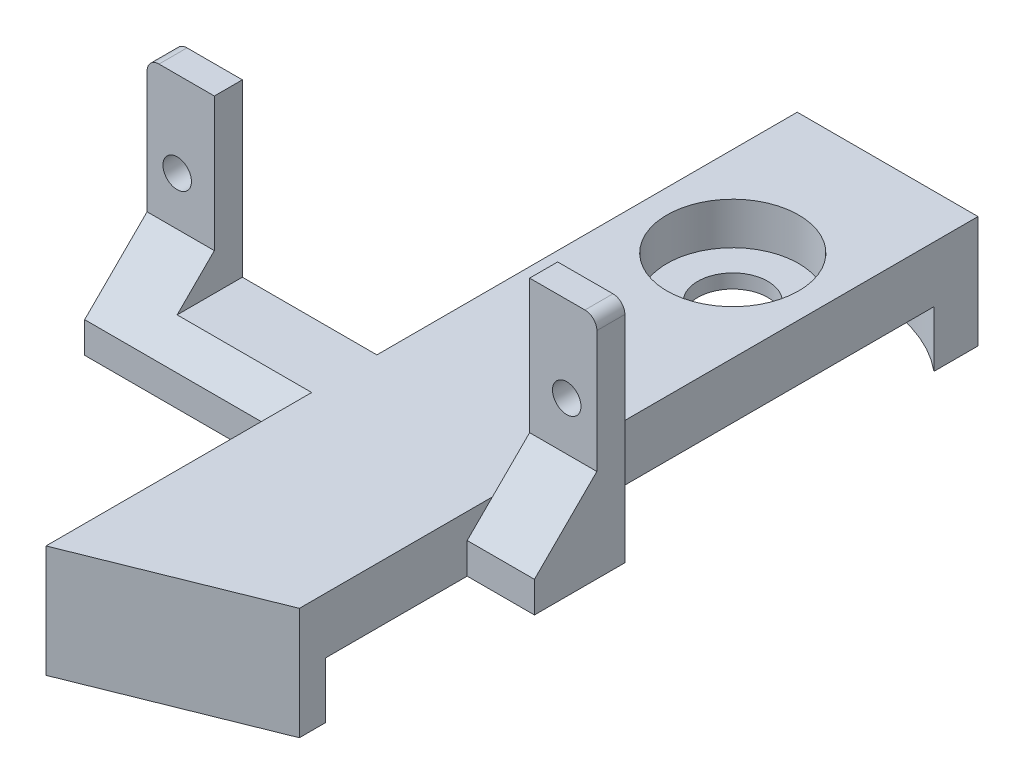
ISO-10303-21;
HEADER;
FILE_DESCRIPTION(('STEP AP214'),'2;1');
FILE_NAME('part.step','',(''),(''),'','','');
FILE_SCHEMA(('AUTOMOTIVE_DESIGN { 1 0 10303 214 1 1 1 1 }'));
ENDSEC;
DATA;
#1=APPLICATION_CONTEXT('core data for automotive mechanical design processes');
#2=APPLICATION_PROTOCOL_DEFINITION('international standard','automotive_design',2000,#1);
#3=PRODUCT_CONTEXT('',#1,'mechanical');
#4=PRODUCT('Part','Part','',(#3));
#5=PRODUCT_RELATED_PRODUCT_CATEGORY('part','',(#4));
#6=PRODUCT_DEFINITION_FORMATION('','',#4);
#7=PRODUCT_DEFINITION_CONTEXT('part definition',#1,'design');
#8=PRODUCT_DEFINITION('design','',#6,#7);
#9=PRODUCT_DEFINITION_SHAPE('','',#8);
#10=(LENGTH_UNIT() NAMED_UNIT(*) SI_UNIT(.MILLI.,.METRE.));
#11=(NAMED_UNIT(*) PLANE_ANGLE_UNIT() SI_UNIT($,.RADIAN.));
#12=(NAMED_UNIT(*) SI_UNIT($,.STERADIAN.) SOLID_ANGLE_UNIT());
#13=UNCERTAINTY_MEASURE_WITH_UNIT(LENGTH_MEASURE(1.E-05),#10,'distance_accuracy_value','');
#14=(GEOMETRIC_REPRESENTATION_CONTEXT(3) GLOBAL_UNCERTAINTY_ASSIGNED_CONTEXT((#13)) GLOBAL_UNIT_ASSIGNED_CONTEXT((#10,
#11,#12)) REPRESENTATION_CONTEXT('',''));
#15=CARTESIAN_POINT('',(0.,0.,0.));
#16=DIRECTION('',(0.,0.,1.));
#17=DIRECTION('',(1.,0.,0.));
#18=AXIS2_PLACEMENT_3D('',#15,#16,#17);
#19=CARTESIAN_POINT('',(24.0462381627888,-9.09999999999987,7.665828595555));
#20=DIRECTION('',(0.,-0.70856176119434,-0.705648801156195));
#21=DIRECTION('',(0.,0.705648801156195,-0.70856176119434));
#22=AXIS2_PLACEMENT_3D('',#19,#20,#21);
#23=PLANE('',#22);
#24=DIRECTION('',(-1.,0.,0.));
#25=VECTOR('',#24,1.);
#26=CARTESIAN_POINT('',(24.0462381627888,-7.89434521112556,6.45519679231599));
#27=LINE('',#26,#25);
#28=CARTESIAN_POINT('',(-1.64999999999999,-7.8943452111257,6.45519679231599));
#29=VERTEX_POINT('',#28);
#30=CARTESIAN_POINT('',(-16.05,-7.89434521112579,6.45519679231599));
#31=VERTEX_POINT('',#30);
#32=EDGE_CURVE('E246',#29,#31,#27,.T.);
#33=ORIENTED_EDGE('',*,*,#32,.F.);
#34=DIRECTION('',(0.,0.705648801156195,-0.70856176119434));
#35=VECTOR('',#34,1.);
#36=CARTESIAN_POINT('',(-1.65000000000002,-5.2671182257889,3.8171244584051));
#37=LINE('',#36,#35);
#38=CARTESIAN_POINT('',(-1.65000000000001,-6.10000000000001,4.65344441790159));
#39=VERTEX_POINT('',#38);
#40=EDGE_CURVE('E253',#29,#39,#37,.T.);
#41=ORIENTED_EDGE('',*,*,#40,.T.);
#42=DIRECTION('',(1.,0.,0.));
#43=VECTOR('',#42,1.);
#44=CARTESIAN_POINT('',(24.0462381627888,-6.09999999999987,4.65344441790159));
#45=LINE('',#44,#43);
#46=CARTESIAN_POINT('',(-11.25,-6.10000000000007,4.65344441790159));
#47=VERTEX_POINT('',#46);
#48=EDGE_CURVE('E434',#47,#39,#45,.T.);
#49=ORIENTED_EDGE('',*,*,#48,.F.);
#50=DIRECTION('',(0.,-0.705648801156195,0.70856176119434));
#51=VECTOR('',#50,1.);
#52=CARTESIAN_POINT('',(-11.25,-9.10000000000007,7.665828595555));
#53=LINE('',#52,#51);
#54=CARTESIAN_POINT('',(-11.25,-3.45746412666863,2.));
#55=VERTEX_POINT('',#54);
#56=EDGE_CURVE('E427',#55,#47,#53,.T.);
#57=ORIENTED_EDGE('',*,*,#56,.F.);
#58=DIRECTION('',(-1.,0.,0.));
#59=VECTOR('',#58,1.);
#60=CARTESIAN_POINT('',(24.0462381627887,-3.45746412666856,2.));
#61=LINE('',#60,#59);
#62=CARTESIAN_POINT('',(-16.05,-3.45746412666879,2.));
#63=VERTEX_POINT('',#62);
#64=EDGE_CURVE('E493',#55,#63,#61,.T.);
#65=ORIENTED_EDGE('',*,*,#64,.T.);
#66=DIRECTION('',(0.,0.705648801156195,-0.70856176119434));
#67=VECTOR('',#66,1.);
#68=CARTESIAN_POINT('',(-16.05,-9.10000000000012,7.66582859555502));
#69=LINE('',#68,#67);
#70=EDGE_CURVE('E491',#31,#63,#69,.T.);
#71=ORIENTED_EDGE('',*,*,#70,.F.);
#72=EDGE_LOOP('',(#33,#41,#49,#57,#65,#71));
#73=FACE_BOUND('',#72,.T.);
#74=ADVANCED_FACE('F34',(#73),#23,.F.);
#75=CARTESIAN_POINT('',(-16.05,0.,2.));
#76=DIRECTION('',(1.,0.,0.));
#77=DIRECTION('',(0.,1.,0.));
#78=AXIS2_PLACEMENT_3D('',#75,#76,#77);
#79=PLANE('',#78);
#80=DIRECTION('',(0.,1.,0.));
#81=VECTOR('',#80,1.);
#82=CARTESIAN_POINT('',(-16.05,-10.1000000000001,6.45519679231599));
#83=LINE('',#82,#81);
#84=CARTESIAN_POINT('',(-16.05,-10.1000000000001,6.45519679231599));
#85=VERTEX_POINT('',#84);
#86=EDGE_CURVE('E481',#85,#31,#83,.T.);
#87=ORIENTED_EDGE('',*,*,#86,.T.);
#88=ORIENTED_EDGE('',*,*,#70,.T.);
#89=DIRECTION('',(0.,-1.,0.));
#90=VECTOR('',#89,1.);
#91=CARTESIAN_POINT('',(-16.05,0.,2.));
#92=LINE('',#91,#90);
#93=CARTESIAN_POINT('',(-16.05,5.25,2.));
#94=VERTEX_POINT('',#93);
#95=EDGE_CURVE('E387',#94,#63,#92,.T.);
#96=ORIENTED_EDGE('',*,*,#95,.F.);
#97=DIRECTION('',(0.,0.,-1.));
#98=VECTOR('',#97,1.);
#99=CARTESIAN_POINT('',(-16.05,5.25,2.));
#100=LINE('',#99,#98);
#101=CARTESIAN_POINT('',(-16.05,5.25,0.));
#102=VERTEX_POINT('',#101);
#103=EDGE_CURVE('E397',#94,#102,#100,.T.);
#104=ORIENTED_EDGE('',*,*,#103,.T.);
#105=DIRECTION('',(0.,-1.,0.));
#106=VECTOR('',#105,1.);
#107=CARTESIAN_POINT('',(-16.05,0.,0.));
#108=LINE('',#107,#106);
#109=CARTESIAN_POINT('',(-16.05,-10.1000000000001,0.));
#110=VERTEX_POINT('',#109);
#111=EDGE_CURVE('E400',#102,#110,#108,.T.);
#112=ORIENTED_EDGE('',*,*,#111,.T.);
#113=DIRECTION('',(0.,0.,-1.));
#114=VECTOR('',#113,1.);
#115=CARTESIAN_POINT('',(-16.05,-10.1000000000001,6.45519679231599));
#116=LINE('',#115,#114);
#117=EDGE_CURVE('E450',#85,#110,#116,.T.);
#118=ORIENTED_EDGE('',*,*,#117,.F.);
#119=EDGE_LOOP('',(#87,#88,#96,#104,#112,#118));
#120=FACE_BOUND('',#119,.T.);
#121=ADVANCED_FACE('F550',(#120),#79,.F.);
#122=DIRECTION('',(0.,-0.705648801156195,0.70856176119434));
#123=VECTOR('',#122,1.);
#124=CARTESIAN_POINT('',(11.25,-5.26711822578882,3.8171244584051));
#125=LINE('',#124,#123);
#126=CARTESIAN_POINT('',(11.25,-6.09999999999994,4.65344441790159));
#127=VERTEX_POINT('',#126);
#128=CARTESIAN_POINT('',(11.25,-7.89434521112563,6.45519679231599));
#129=VERTEX_POINT('',#128);
#130=EDGE_CURVE('E231',#127,#129,#125,.T.);
#131=ORIENTED_EDGE('',*,*,#130,.T.);
#132=DIRECTION('',(1.,0.,0.));
#133=VECTOR('',#132,1.);
#134=CARTESIAN_POINT('',(24.0462381627888,-7.89434521112556,6.45519679231599));
#135=LINE('',#134,#133);
#136=CARTESIAN_POINT('',(16.05,-7.8943452111256,6.45519679231599));
#137=VERTEX_POINT('',#136);
#138=EDGE_CURVE('E240',#129,#137,#135,.T.);
#139=ORIENTED_EDGE('',*,*,#138,.T.);
#140=DIRECTION('',(0.,0.705648801156195,-0.70856176119434));
#141=VECTOR('',#140,1.);
#142=CARTESIAN_POINT('',(16.05,-9.09999999999991,7.665828595555));
#143=LINE('',#142,#141);
#144=CARTESIAN_POINT('',(16.05,-3.45746412666861,2.));
#145=VERTEX_POINT('',#144);
#146=EDGE_CURVE('E259',#137,#145,#143,.T.);
#147=ORIENTED_EDGE('',*,*,#146,.T.);
#148=CARTESIAN_POINT('',(11.25,-3.45746412666863,2.));
#149=VERTEX_POINT('',#148);
#150=EDGE_CURVE('E494',#145,#149,#61,.T.);
#151=ORIENTED_EDGE('',*,*,#150,.T.);
#152=DIRECTION('',(0.,0.705648801156195,-0.70856176119434));
#153=VECTOR('',#152,1.);
#154=CARTESIAN_POINT('',(11.25,-9.09999999999994,7.665828595555));
#155=LINE('',#154,#153);
#156=EDGE_CURVE('E251',#127,#149,#155,.T.);
#157=ORIENTED_EDGE('',*,*,#156,.F.);
#158=EDGE_LOOP('',(#131,#139,#147,#151,#157));
#159=FACE_BOUND('',#158,.T.);
#160=ADVANCED_FACE('F249',(#159),#23,.F.);
#161=CARTESIAN_POINT('',(0.,0.,2.));
#162=DIRECTION('',(0.,0.,1.));
#163=DIRECTION('',(1.,0.,0.));
#164=AXIS2_PLACEMENT_3D('',#161,#162,#163);
#165=PLANE('',#164);
#166=CARTESIAN_POINT('',(-13.9,0.,2.));
#167=DIRECTION('',(0.,0.,1.));
#168=DIRECTION('',(1.,0.,0.));
#169=AXIS2_PLACEMENT_3D('',#166,#167,#168);
#170=CIRCLE('',#169,1.016);
#171=CARTESIAN_POINT('',(-12.884,0.,2.));
#172=VERTEX_POINT('',#171);
#173=EDGE_CURVE('E384',#172,#172,#170,.T.);
#174=ORIENTED_EDGE('',*,*,#173,.F.);
#175=EDGE_LOOP('',(#174));
#176=FACE_BOUND('',#175,.T.);
#177=ORIENTED_EDGE('',*,*,#95,.T.);
#178=ORIENTED_EDGE('',*,*,#64,.F.);
#179=DIRECTION('',(0.,-1.,0.));
#180=VECTOR('',#179,1.);
#181=CARTESIAN_POINT('',(-11.25,0.,2.));
#182=LINE('',#181,#180);
#183=CARTESIAN_POINT('',(-11.25,6.1,2.));
#184=VERTEX_POINT('',#183);
#185=EDGE_CURVE('E391',#184,#55,#182,.T.);
#186=ORIENTED_EDGE('',*,*,#185,.F.);
#187=DIRECTION('',(-1.,0.,0.));
#188=VECTOR('',#187,1.);
#189=CARTESIAN_POINT('',(0.,6.1,2.));
#190=LINE('',#189,#188);
#191=CARTESIAN_POINT('',(-15.2,6.1,2.));
#192=VERTEX_POINT('',#191);
#193=EDGE_CURVE('E393',#184,#192,#190,.T.);
#194=ORIENTED_EDGE('',*,*,#193,.T.);
#195=CARTESIAN_POINT('',(-15.2,5.25,2.));
#196=DIRECTION('',(0.,0.,1.));
#197=DIRECTION('',(1.,0.,0.));
#198=AXIS2_PLACEMENT_3D('',#195,#196,#197);
#199=CIRCLE('',#198,0.850000000000002);
#200=EDGE_CURVE('E395',#192,#94,#199,.T.);
#201=ORIENTED_EDGE('',*,*,#200,.T.);
#202=EDGE_LOOP('',(#177,#178,#186,#194,#201));
#203=FACE_BOUND('',#202,.T.);
#204=ADVANCED_FACE('F561',(#176,#203),#165,.T.);
#205=CARTESIAN_POINT('',(0.,-9.1,2.));
#206=DIRECTION('',(0.,0.,-1.));
#207=DIRECTION('',(-1.,0.,0.));
#208=AXIS2_PLACEMENT_3D('',#205,#206,#207);
#209=PLANE('',#208);
#210=CARTESIAN_POINT('',(13.9,0.,2.));
#211=DIRECTION('',(0.,0.,1.));
#212=DIRECTION('',(1.,0.,0.));
#213=AXIS2_PLACEMENT_3D('',#210,#211,#212);
#214=CIRCLE('',#213,1.016);
#215=CARTESIAN_POINT('',(14.916,0.,2.));
#216=VERTEX_POINT('',#215);
#217=EDGE_CURVE('E312',#216,#216,#214,.T.);
#218=ORIENTED_EDGE('',*,*,#217,.F.);
#219=EDGE_LOOP('',(#218));
#220=FACE_BOUND('',#219,.T.);
#221=ORIENTED_EDGE('',*,*,#150,.F.);
#222=DIRECTION('',(0.,1.,0.));
#223=VECTOR('',#222,1.);
#224=CARTESIAN_POINT('',(16.05,-9.09999999999991,2.));
#225=LINE('',#224,#223);
#226=CARTESIAN_POINT('',(16.05,5.25,2.));
#227=VERTEX_POINT('',#226);
#228=EDGE_CURVE('E370',#145,#227,#225,.T.);
#229=ORIENTED_EDGE('',*,*,#228,.T.);
#230=CARTESIAN_POINT('',(15.2,5.25,2.));
#231=DIRECTION('',(0.,0.,1.));
#232=DIRECTION('',(1.,0.,0.));
#233=AXIS2_PLACEMENT_3D('',#230,#231,#232);
#234=CIRCLE('',#233,0.849999999999998);
#235=CARTESIAN_POINT('',(15.2,6.1,2.));
#236=VERTEX_POINT('',#235);
#237=EDGE_CURVE('E315',#227,#236,#234,.T.);
#238=ORIENTED_EDGE('',*,*,#237,.T.);
#239=DIRECTION('',(0.999998883397845,0.00149439053219066,0.));
#240=VECTOR('',#239,1.);
#241=CARTESIAN_POINT('',(-0.00908182738110785,6.07727166673534,2.));
#242=LINE('',#241,#240);
#243=CARTESIAN_POINT('',(11.25,6.09409715080671,2.));
#244=VERTEX_POINT('',#243);
#245=EDGE_CURVE('E318',#244,#236,#242,.T.);
#246=ORIENTED_EDGE('',*,*,#245,.F.);
#247=DIRECTION('',(0.,1.,0.));
#248=VECTOR('',#247,1.);
#249=CARTESIAN_POINT('',(11.25,0.,2.));
#250=LINE('',#249,#248);
#251=EDGE_CURVE('E321',#149,#244,#250,.T.);
#252=ORIENTED_EDGE('',*,*,#251,.F.);
#253=EDGE_LOOP('',(#221,#229,#238,#246,#252));
#254=FACE_BOUND('',#253,.T.);
#255=ADVANCED_FACE('F500',(#220,#254),#209,.F.);
#256=CARTESIAN_POINT('',(11.25,-9.09999999999994,0.));
#257=DIRECTION('',(-1.,0.,0.));
#258=DIRECTION('',(0.,-1.,0.));
#259=AXIS2_PLACEMENT_3D('',#256,#257,#258);
#260=PLANE('',#259);
#261=DIRECTION('',(0.,0.,1.));
#262=VECTOR('',#261,1.);
#263=CARTESIAN_POINT('',(11.25,-6.09999999999994,0.));
#264=LINE('',#263,#262);
#265=CARTESIAN_POINT('',(11.25,-6.09999999999994,18.4293668492978));
#266=VERTEX_POINT('',#265);
#267=EDGE_CURVE('E350',#127,#266,#264,.T.);
#268=ORIENTED_EDGE('',*,*,#267,.T.);
#269=DIRECTION('',(0.,1.,0.));
#270=VECTOR('',#269,1.);
#271=CARTESIAN_POINT('',(11.25,-9.09999999999994,18.4293668492978));
#272=LINE('',#271,#270);
#273=CARTESIAN_POINT('',(11.2500000000001,-14.0999999999999,18.4293668492978));
#274=VERTEX_POINT('',#273);
#275=EDGE_CURVE('E367',#274,#266,#272,.T.);
#276=ORIENTED_EDGE('',*,*,#275,.F.);
#277=DIRECTION('',(0.,0.,1.));
#278=VECTOR('',#277,1.);
#279=CARTESIAN_POINT('',(11.2500000000001,-14.0999999999999,0.));
#280=LINE('',#279,#278);
#281=CARTESIAN_POINT('',(11.2500000000001,-14.0999999999999,16.5531395075691));
#282=VERTEX_POINT('',#281);
#283=EDGE_CURVE('E290',#282,#274,#280,.T.);
#284=ORIENTED_EDGE('',*,*,#283,.F.);
#285=DIRECTION('',(0.,1.,0.));
#286=VECTOR('',#285,1.);
#287=CARTESIAN_POINT('',(11.2500000000001,-14.0999999999999,16.5531395075691));
#288=LINE('',#287,#286);
#289=CARTESIAN_POINT('',(11.25,-10.0999999999999,16.5531395075691));
#290=VERTEX_POINT('',#289);
#291=EDGE_CURVE('E309',#282,#290,#288,.T.);
#292=ORIENTED_EDGE('',*,*,#291,.T.);
#293=DIRECTION('',(0.,0.,1.));
#294=VECTOR('',#293,1.);
#295=CARTESIAN_POINT('',(11.25,-10.0999999999999,6.45519679231599));
#296=LINE('',#295,#294);
#297=CARTESIAN_POINT('',(11.25,-10.0999999999999,6.45519679231599));
#298=VERTEX_POINT('',#297);
#299=EDGE_CURVE('E49',#298,#290,#296,.T.);
#300=ORIENTED_EDGE('',*,*,#299,.F.);
#301=DIRECTION('',(0.,1.,0.));
#302=VECTOR('',#301,1.);
#303=CARTESIAN_POINT('',(11.25,-10.0999999999999,6.45519679231599));
#304=LINE('',#303,#302);
#305=EDGE_CURVE('E227',#298,#129,#304,.T.);
#306=ORIENTED_EDGE('',*,*,#305,.T.);
#307=ORIENTED_EDGE('',*,*,#130,.F.);
#308=EDGE_LOOP('',(#268,#276,#284,#292,#300,#306,#307));
#309=FACE_BOUND('',#308,.T.);
#310=ADVANCED_FACE('F229',(#309),#260,.F.);
#311=CARTESIAN_POINT('',(-1.65,-9.10000000000001,0.));
#312=DIRECTION('',(1.,0.,0.));
#313=DIRECTION('',(0.,1.,0.));
#314=AXIS2_PLACEMENT_3D('',#311,#312,#313);
#315=PLANE('',#314);
#316=ORIENTED_EDGE('',*,*,#40,.F.);
#317=DIRECTION('',(0.,1.,0.));
#318=VECTOR('',#317,1.);
#319=CARTESIAN_POINT('',(-1.64999999999999,-10.1,6.45519679231599));
#320=LINE('',#319,#318);
#321=CARTESIAN_POINT('',(-1.64999999999999,-10.1,6.45519679231599));
#322=VERTEX_POINT('',#321);
#323=EDGE_CURVE('E483',#322,#29,#320,.T.);
#324=ORIENTED_EDGE('',*,*,#323,.F.);
#325=DIRECTION('',(0.,0.,-1.));
#326=VECTOR('',#325,1.);
#327=CARTESIAN_POINT('',(-1.64999999999999,-10.1,22.6129650137352));
#328=LINE('',#327,#326);
#329=CARTESIAN_POINT('',(-1.64999999999999,-10.1,22.6129650137352));
#330=VERTEX_POINT('',#329);
#331=EDGE_CURVE('E1030',#330,#322,#328,.T.);
#332=ORIENTED_EDGE('',*,*,#331,.F.);
#333=DIRECTION('',(0.,1.,0.));
#334=VECTOR('',#333,1.);
#335=CARTESIAN_POINT('',(-1.64999999999997,-14.1,22.6129650137352));
#336=LINE('',#335,#334);
#337=CARTESIAN_POINT('',(-1.64999999999997,-14.1,22.6129650137352));
#338=VERTEX_POINT('',#337);
#339=EDGE_CURVE('E57',#338,#330,#336,.T.);
#340=ORIENTED_EDGE('',*,*,#339,.F.);
#341=DIRECTION('',(0.,0.,-1.));
#342=VECTOR('',#341,1.);
#343=CARTESIAN_POINT('',(-1.64999999999997,-14.1,0.));
#344=LINE('',#343,#342);
#345=CARTESIAN_POINT('',(-1.64999999999997,-14.1,23.6139020234791));
#346=VERTEX_POINT('',#345);
#347=EDGE_CURVE('E296',#346,#338,#344,.T.);
#348=ORIENTED_EDGE('',*,*,#347,.F.);
#349=DIRECTION('',(0.,1.,0.));
#350=VECTOR('',#349,1.);
#351=CARTESIAN_POINT('',(-1.65,-9.10000000000001,23.6139020234791));
#352=LINE('',#351,#350);
#353=CARTESIAN_POINT('',(-1.65000000000002,-6.10000000000001,23.6139020234791));
#354=VERTEX_POINT('',#353);
#355=EDGE_CURVE('E365',#346,#354,#352,.T.);
#356=ORIENTED_EDGE('',*,*,#355,.T.);
#357=DIRECTION('',(0.,0.,-1.));
#358=VECTOR('',#357,1.);
#359=CARTESIAN_POINT('',(-1.65000000000001,-6.10000000000001,0.));
#360=LINE('',#359,#358);
#361=EDGE_CURVE('E355',#354,#39,#360,.T.);
#362=ORIENTED_EDGE('',*,*,#361,.T.);
#363=EDGE_LOOP('',(#316,#324,#332,#340,#348,#356,#362));
#364=FACE_BOUND('',#363,.T.);
#365=ADVANCED_FACE('F590',(#364),#315,.F.);
#366=CARTESIAN_POINT('',(0.,-6.1,0.));
#367=DIRECTION('',(0.,-1.,0.));
#368=DIRECTION('',(1.,0.,0.));
#369=AXIS2_PLACEMENT_3D('',#366,#367,#368);
#370=PLANE('',#369);
#371=DIRECTION('',(0.,0.,-1.));
#372=VECTOR('',#371,1.);
#373=CARTESIAN_POINT('',(11.25,-6.1,2.));
#374=LINE('',#373,#372);
#375=CARTESIAN_POINT('',(11.25,-6.1,0.));
#376=VERTEX_POINT('',#375);
#377=EDGE_CURVE('E323',#127,#376,#374,.T.);
#378=ORIENTED_EDGE('',*,*,#377,.T.);
#379=DIRECTION('',(0.,0.,-1.));
#380=VECTOR('',#379,1.);
#381=CARTESIAN_POINT('',(11.25,-6.09999999999994,0.));
#382=LINE('',#381,#380);
#383=CARTESIAN_POINT('',(11.25,-6.09999999999994,-29.9998304323907));
#384=VERTEX_POINT('',#383);
#385=EDGE_CURVE('E348',#376,#384,#382,.T.);
#386=ORIENTED_EDGE('',*,*,#385,.T.);
#387=DIRECTION('',(1.,0.,0.));
#388=VECTOR('',#387,1.);
#389=CARTESIAN_POINT('',(0.,-6.1,-29.9998304323907));
#390=LINE('',#389,#388);
#391=CARTESIAN_POINT('',(-1.65000000000001,-6.10000000000001,-29.9998304323907));
#392=VERTEX_POINT('',#391);
#393=EDGE_CURVE('E345',#392,#384,#390,.T.);
#394=ORIENTED_EDGE('',*,*,#393,.F.);
#395=DIRECTION('',(0.,0.,-1.));
#396=VECTOR('',#395,1.);
#397=CARTESIAN_POINT('',(-1.65000000000001,-6.10000000000001,0.));
#398=LINE('',#397,#396);
#399=CARTESIAN_POINT('',(-1.65000000000001,-6.10000000000001,0.));
#400=VERTEX_POINT('',#399);
#401=EDGE_CURVE('E343',#400,#392,#398,.T.);
#402=ORIENTED_EDGE('',*,*,#401,.F.);
#403=DIRECTION('',(-1.,0.,0.));
#404=VECTOR('',#403,1.);
#405=CARTESIAN_POINT('',(0.,-6.1,0.));
#406=LINE('',#405,#404);
#407=CARTESIAN_POINT('',(-11.25,-6.1,0.));
#408=VERTEX_POINT('',#407);
#409=EDGE_CURVE('E357',#400,#408,#406,.T.);
#410=ORIENTED_EDGE('',*,*,#409,.T.);
#411=DIRECTION('',(0.,0.,-1.));
#412=VECTOR('',#411,1.);
#413=CARTESIAN_POINT('',(-11.25,-6.1,2.));
#414=LINE('',#413,#412);
#415=EDGE_CURVE('E11',#47,#408,#414,.T.);
#416=ORIENTED_EDGE('',*,*,#415,.F.);
#417=ORIENTED_EDGE('',*,*,#48,.T.);
#418=ORIENTED_EDGE('',*,*,#361,.F.);
#419=DIRECTION('',(0.92786690730882,0.,-0.372911520767549));
#420=VECTOR('',#419,1.);
#421=CARTESIAN_POINT('',(7.94124564032156,-6.09999999999996,19.7591616834435));
#422=LINE('',#421,#420);
#423=EDGE_CURVE('E352',#354,#266,#422,.T.);
#424=ORIENTED_EDGE('',*,*,#423,.T.);
#425=ORIENTED_EDGE('',*,*,#267,.F.);
#426=EDGE_LOOP('',(#378,#386,#394,#402,#410,#416,#417,#418,#424,#425));
#427=FACE_BOUND('',#426,.T.);
#428=CARTESIAN_POINT('',(4.74999999999999,-6.09999999999998,-19.));
#429=DIRECTION('',(0.,-1.,0.));
#430=DIRECTION('',(1.,0.,0.));
#431=AXIS2_PLACEMENT_3D('',#428,#429,#430);
#432=CIRCLE('',#431,4.7);
#433=CARTESIAN_POINT('',(9.44999999999999,-6.09999999999995,-19.));
#434=VERTEX_POINT('',#433);
#435=EDGE_CURVE('E360',#434,#434,#432,.T.);
#436=ORIENTED_EDGE('',*,*,#435,.T.);
#437=EDGE_LOOP('',(#436));
#438=FACE_BOUND('',#437,.T.);
#439=ADVANCED_FACE('F431',(#427,#438),#370,.F.);
#440=CARTESIAN_POINT('',(-11.25,0.,2.));
#441=DIRECTION('',(1.,0.,0.));
#442=DIRECTION('',(0.,1.,0.));
#443=AXIS2_PLACEMENT_3D('',#440,#441,#442);
#444=PLANE('',#443);
#445=ORIENTED_EDGE('',*,*,#185,.T.);
#446=ORIENTED_EDGE('',*,*,#56,.T.);
#447=ORIENTED_EDGE('',*,*,#415,.T.);
#448=DIRECTION('',(0.,-1.,0.));
#449=VECTOR('',#448,1.);
#450=CARTESIAN_POINT('',(-11.25,0.,0.));
#451=LINE('',#450,#449);
#452=CARTESIAN_POINT('',(-11.25,6.1,0.));
#453=VERTEX_POINT('',#452);
#454=EDGE_CURVE('E402',#453,#408,#451,.T.);
#455=ORIENTED_EDGE('',*,*,#454,.F.);
#456=DIRECTION('',(0.,0.,-1.));
#457=VECTOR('',#456,1.);
#458=CARTESIAN_POINT('',(-11.25,6.1,2.));
#459=LINE('',#458,#457);
#460=EDGE_CURVE('E42',#184,#453,#459,.T.);
#461=ORIENTED_EDGE('',*,*,#460,.F.);
#462=EDGE_LOOP('',(#445,#446,#447,#455,#461));
#463=FACE_BOUND('',#462,.T.);
#464=ADVANCED_FACE('F424',(#463),#444,.T.);
#465=CARTESIAN_POINT('',(0.,6.1,2.));
#466=DIRECTION('',(0.,-1.,0.));
#467=DIRECTION('',(0.,0.,-1.));
#468=AXIS2_PLACEMENT_3D('',#465,#466,#467);
#469=PLANE('',#468);
#470=DIRECTION('',(-1.,0.,0.));
#471=VECTOR('',#470,1.);
#472=CARTESIAN_POINT('',(0.,6.1,0.));
#473=LINE('',#472,#471);
#474=CARTESIAN_POINT('',(-15.2,6.1,0.));
#475=VERTEX_POINT('',#474);
#476=EDGE_CURVE('E404',#453,#475,#473,.T.);
#477=ORIENTED_EDGE('',*,*,#476,.T.);
#478=DIRECTION('',(0.,0.,-1.));
#479=VECTOR('',#478,1.);
#480=CARTESIAN_POINT('',(-15.2,6.1,2.));
#481=LINE('',#480,#479);
#482=EDGE_CURVE('E409',#192,#475,#481,.T.);
#483=ORIENTED_EDGE('',*,*,#482,.F.);
#484=ORIENTED_EDGE('',*,*,#193,.F.);
#485=ORIENTED_EDGE('',*,*,#460,.T.);
#486=EDGE_LOOP('',(#477,#483,#484,#485));
#487=FACE_BOUND('',#486,.T.);
#488=ADVANCED_FACE('F414',(#487),#469,.F.);
#489=CARTESIAN_POINT('',(-13.9,0.,2.));
#490=DIRECTION('',(0.,0.,-1.));
#491=DIRECTION('',(-1.,0.,0.));
#492=AXIS2_PLACEMENT_3D('',#489,#490,#491);
#493=CYLINDRICAL_SURFACE('',#492,1.016);
#494=ORIENTED_EDGE('',*,*,#173,.T.);
#495=EDGE_LOOP('',(#494));
#496=FACE_BOUND('',#495,.T.);
#497=CARTESIAN_POINT('',(-13.9,0.,0.));
#498=DIRECTION('',(0.,0.,1.));
#499=DIRECTION('',(1.,0.,0.));
#500=AXIS2_PLACEMENT_3D('',#497,#498,#499);
#501=CIRCLE('',#500,1.016);
#502=CARTESIAN_POINT('',(-12.884,0.,0.));
#503=VERTEX_POINT('',#502);
#504=EDGE_CURVE('E383',#503,#503,#501,.T.);
#505=ORIENTED_EDGE('',*,*,#504,.F.);
#506=EDGE_LOOP('',(#505));
#507=FACE_BOUND('',#506,.T.);
#508=ADVANCED_FACE('F36',(#496,#507),#493,.F.);
#509=CARTESIAN_POINT('',(-15.2,5.25,2.));
#510=DIRECTION('',(0.,0.,-1.));
#511=DIRECTION('',(-1.,0.,0.));
#512=AXIS2_PLACEMENT_3D('',#509,#510,#511);
#513=CYLINDRICAL_SURFACE('',#512,0.850000000000002);
#514=CARTESIAN_POINT('',(-15.2,5.25,0.));
#515=DIRECTION('',(0.,0.,1.));
#516=DIRECTION('',(1.,0.,0.));
#517=AXIS2_PLACEMENT_3D('',#514,#515,#516);
#518=CIRCLE('',#517,0.850000000000002);
#519=EDGE_CURVE('E388',#475,#102,#518,.T.);
#520=ORIENTED_EDGE('',*,*,#519,.T.);
#521=ORIENTED_EDGE('',*,*,#103,.F.);
#522=ORIENTED_EDGE('',*,*,#200,.F.);
#523=ORIENTED_EDGE('',*,*,#482,.T.);
#524=EDGE_LOOP('',(#520,#521,#522,#523));
#525=FACE_BOUND('',#524,.T.);
#526=ADVANCED_FACE('F579',(#525),#513,.T.);
#527=CARTESIAN_POINT('',(0.,0.,0.));
#528=DIRECTION('',(0.,0.,1.));
#529=DIRECTION('',(1.,0.,0.));
#530=AXIS2_PLACEMENT_3D('',#527,#528,#529);
#531=PLANE('',#530);
#532=ORIENTED_EDGE('',*,*,#504,.T.);
#533=EDGE_LOOP('',(#532));
#534=FACE_BOUND('',#533,.T.);
#535=ORIENTED_EDGE('',*,*,#111,.F.);
#536=ORIENTED_EDGE('',*,*,#519,.F.);
#537=ORIENTED_EDGE('',*,*,#476,.F.);
#538=ORIENTED_EDGE('',*,*,#454,.T.);
#539=ORIENTED_EDGE('',*,*,#409,.F.);
#540=DIRECTION('',(0.,1.,0.));
#541=VECTOR('',#540,1.);
#542=CARTESIAN_POINT('',(-1.65,-9.10000000000001,0.));
#543=LINE('',#542,#541);
#544=CARTESIAN_POINT('',(-1.64999999999999,-10.1,0.));
#545=VERTEX_POINT('',#544);
#546=EDGE_CURVE('E363',#545,#400,#543,.T.);
#547=ORIENTED_EDGE('',*,*,#546,.F.);
#548=DIRECTION('',(1.,0.,0.));
#549=VECTOR('',#548,1.);
#550=CARTESIAN_POINT('',(-16.05,-10.1000000000001,0.));
#551=LINE('',#550,#549);
#552=EDGE_CURVE('E439',#110,#545,#551,.T.);
#553=ORIENTED_EDGE('',*,*,#552,.F.);
#554=EDGE_LOOP('',(#535,#536,#537,#538,#539,#547,#553));
#555=FACE_BOUND('',#554,.T.);
#556=ADVANCED_FACE('F422',(#534,#555),#531,.F.);
#557=CARTESIAN_POINT('',(-1.65,-9.10000000000001,0.));
#558=DIRECTION('',(1.,0.,0.));
#559=DIRECTION('',(0.,1.,0.));
#560=AXIS2_PLACEMENT_3D('',#557,#558,#559);
#561=PLANE('',#560);
#562=ORIENTED_EDGE('',*,*,#401,.T.);
#563=DIRECTION('',(0.,1.,0.));
#564=VECTOR('',#563,1.);
#565=CARTESIAN_POINT('',(-1.64999999999999,-9.10000000000001,-29.9998304323907));
#566=LINE('',#565,#564);
#567=CARTESIAN_POINT('',(-1.64999999999997,-14.1,-29.9998304323907));
#568=VERTEX_POINT('',#567);
#569=EDGE_CURVE('E380',#568,#392,#566,.T.);
#570=ORIENTED_EDGE('',*,*,#569,.F.);
#571=DIRECTION('',(0.,0.,-1.));
#572=VECTOR('',#571,1.);
#573=CARTESIAN_POINT('',(-1.64999999999997,-14.1,0.));
#574=LINE('',#573,#572);
#575=CARTESIAN_POINT('',(-1.64999999999997,-14.1,-29.1007438889249));
#576=VERTEX_POINT('',#575);
#577=EDGE_CURVE('E256',#576,#568,#574,.T.);
#578=ORIENTED_EDGE('',*,*,#577,.F.);
#579=DIRECTION('',(0.,1.,0.));
#580=VECTOR('',#579,1.);
#581=CARTESIAN_POINT('',(-1.64999999999997,-14.1,-29.1007438889249));
#582=LINE('',#581,#580);
#583=CARTESIAN_POINT('',(-1.64999999999999,-10.1,-29.1007438889249));
#584=VERTEX_POINT('',#583);
#585=EDGE_CURVE('E284',#576,#584,#582,.T.);
#586=ORIENTED_EDGE('',*,*,#585,.T.);
#587=DIRECTION('',(0.,0.,-1.));
#588=VECTOR('',#587,1.);
#589=CARTESIAN_POINT('',(-1.64999999999999,-10.1,0.));
#590=LINE('',#589,#588);
#591=EDGE_CURVE('E448',#545,#584,#590,.T.);
#592=ORIENTED_EDGE('',*,*,#591,.F.);
#593=ORIENTED_EDGE('',*,*,#546,.T.);
#594=EDGE_LOOP('',(#562,#570,#578,#586,#592,#593));
#595=FACE_BOUND('',#594,.T.);
#596=ADVANCED_FACE('F452',(#595),#561,.F.);
#597=CARTESIAN_POINT('',(0.,-9.1,-29.9998304323907));
#598=DIRECTION('',(0.,0.,1.));
#599=DIRECTION('',(1.,0.,0.));
#600=AXIS2_PLACEMENT_3D('',#597,#598,#599);
#601=PLANE('',#600);
#602=ORIENTED_EDGE('',*,*,#393,.T.);
#603=DIRECTION('',(0.,1.,0.));
#604=VECTOR('',#603,1.);
#605=CARTESIAN_POINT('',(11.25,-9.09999999999994,-29.9998304323907));
#606=LINE('',#605,#604);
#607=CARTESIAN_POINT('',(11.2500000000001,-14.0999999999999,-29.9998304323907));
#608=VERTEX_POINT('',#607);
#609=EDGE_CURVE('E377',#608,#384,#606,.T.);
#610=ORIENTED_EDGE('',*,*,#609,.F.);
#611=DIRECTION('',(1.,0.,0.));
#612=VECTOR('',#611,1.);
#613=CARTESIAN_POINT('',(0.,-14.1,-29.9998304323907));
#614=LINE('',#613,#612);
#615=EDGE_CURVE('E265',#568,#608,#614,.T.);
#616=ORIENTED_EDGE('',*,*,#615,.F.);
#617=ORIENTED_EDGE('',*,*,#569,.T.);
#618=EDGE_LOOP('',(#602,#610,#616,#617));
#619=FACE_BOUND('',#618,.T.);
#620=ADVANCED_FACE('F527',(#619),#601,.F.);
#621=CARTESIAN_POINT('',(11.25,-9.09999999999994,0.));
#622=DIRECTION('',(1.,0.,0.));
#623=DIRECTION('',(0.,1.,0.));
#624=AXIS2_PLACEMENT_3D('',#621,#622,#623);
#625=PLANE('',#624);
#626=DIRECTION('',(0.,1.,0.));
#627=VECTOR('',#626,1.);
#628=CARTESIAN_POINT('',(11.25,-9.09999999999994,0.));
#629=LINE('',#628,#627);
#630=CARTESIAN_POINT('',(11.25,-10.0999999999999,0.));
#631=VERTEX_POINT('',#630);
#632=EDGE_CURVE('E374',#631,#376,#629,.T.);
#633=ORIENTED_EDGE('',*,*,#632,.F.);
#634=DIRECTION('',(0.,0.,1.));
#635=VECTOR('',#634,1.);
#636=CARTESIAN_POINT('',(11.25,-10.0999999999999,-26.8606615497679));
#637=LINE('',#636,#635);
#638=CARTESIAN_POINT('',(11.25,-10.0999999999999,-26.8606615497679));
#639=VERTEX_POINT('',#638);
#640=EDGE_CURVE('E465',#639,#631,#637,.T.);
#641=ORIENTED_EDGE('',*,*,#640,.F.);
#642=DIRECTION('',(0.,1.,0.));
#643=VECTOR('',#642,1.);
#644=CARTESIAN_POINT('',(11.2500000000001,-14.0999999999999,-26.8606615497679));
#645=LINE('',#644,#643);
#646=CARTESIAN_POINT('',(11.2500000000001,-14.0999999999999,-26.8606615497679));
#647=VERTEX_POINT('',#646);
#648=EDGE_CURVE('E282',#647,#639,#645,.T.);
#649=ORIENTED_EDGE('',*,*,#648,.F.);
#650=DIRECTION('',(0.,0.,-1.));
#651=VECTOR('',#650,1.);
#652=CARTESIAN_POINT('',(11.2500000000001,-14.0999999999999,0.));
#653=LINE('',#652,#651);
#654=EDGE_CURVE('E268',#647,#608,#653,.T.);
#655=ORIENTED_EDGE('',*,*,#654,.T.);
#656=ORIENTED_EDGE('',*,*,#609,.T.);
#657=ORIENTED_EDGE('',*,*,#385,.F.);
#658=EDGE_LOOP('',(#633,#641,#649,#655,#656,#657));
#659=FACE_BOUND('',#658,.T.);
#660=ADVANCED_FACE('F523',(#659),#625,.T.);
#661=CARTESIAN_POINT('',(0.,-9.1,0.));
#662=DIRECTION('',(0.,0.,1.));
#663=DIRECTION('',(1.,0.,0.));
#664=AXIS2_PLACEMENT_3D('',#661,#662,#663);
#665=PLANE('',#664);
#666=ORIENTED_EDGE('',*,*,#632,.T.);
#667=DIRECTION('',(0.,1.,0.));
#668=VECTOR('',#667,1.);
#669=CARTESIAN_POINT('',(11.25,0.,0.));
#670=LINE('',#669,#668);
#671=CARTESIAN_POINT('',(11.25,6.09409715080671,0.));
#672=VERTEX_POINT('',#671);
#673=EDGE_CURVE('E316',#376,#672,#670,.T.);
#674=ORIENTED_EDGE('',*,*,#673,.T.);
#675=DIRECTION('',(0.999998883397845,0.00149439053219066,0.));
#676=VECTOR('',#675,1.);
#677=CARTESIAN_POINT('',(-0.00908182738110785,6.07727166673534,0.));
#678=LINE('',#677,#676);
#679=CARTESIAN_POINT('',(15.2,6.1,0.));
#680=VERTEX_POINT('',#679);
#681=EDGE_CURVE('E329',#672,#680,#678,.T.);
#682=ORIENTED_EDGE('',*,*,#681,.T.);
#683=CARTESIAN_POINT('',(15.2,5.25,0.));
#684=DIRECTION('',(0.,0.,1.));
#685=DIRECTION('',(1.,0.,0.));
#686=AXIS2_PLACEMENT_3D('',#683,#684,#685);
#687=CIRCLE('',#686,0.849999999999998);
#688=CARTESIAN_POINT('',(16.05,5.25,0.));
#689=VERTEX_POINT('',#688);
#690=EDGE_CURVE('E326',#689,#680,#687,.T.);
#691=ORIENTED_EDGE('',*,*,#690,.F.);
#692=DIRECTION('',(0.,1.,0.));
#693=VECTOR('',#692,1.);
#694=CARTESIAN_POINT('',(16.05,-9.09999999999991,0.));
#695=LINE('',#694,#693);
#696=CARTESIAN_POINT('',(16.05,-10.0999999999999,0.));
#697=VERTEX_POINT('',#696);
#698=EDGE_CURVE('E372',#697,#689,#695,.T.);
#699=ORIENTED_EDGE('',*,*,#698,.F.);
#700=DIRECTION('',(1.,0.,0.));
#701=VECTOR('',#700,1.);
#702=CARTESIAN_POINT('',(11.25,-10.0999999999999,0.));
#703=LINE('',#702,#701);
#704=EDGE_CURVE('E468',#631,#697,#703,.T.);
#705=ORIENTED_EDGE('',*,*,#704,.F.);
#706=EDGE_LOOP('',(#666,#674,#682,#691,#699,#705));
#707=FACE_BOUND('',#706,.T.);
#708=CARTESIAN_POINT('',(13.9,0.,0.));
#709=DIRECTION('',(0.,0.,1.));
#710=DIRECTION('',(1.,0.,0.));
#711=AXIS2_PLACEMENT_3D('',#708,#709,#710);
#712=CIRCLE('',#711,1.016);
#713=CARTESIAN_POINT('',(14.916,0.,0.));
#714=VERTEX_POINT('',#713);
#715=EDGE_CURVE('E311',#714,#714,#712,.T.);
#716=ORIENTED_EDGE('',*,*,#715,.T.);
#717=EDGE_LOOP('',(#716));
#718=FACE_BOUND('',#717,.T.);
#719=ADVANCED_FACE('F519',(#707,#718),#665,.F.);
#720=CARTESIAN_POINT('',(16.05,-9.09999999999991,0.));
#721=DIRECTION('',(-1.,0.,0.));
#722=DIRECTION('',(0.,-1.,0.));
#723=AXIS2_PLACEMENT_3D('',#720,#721,#722);
#724=PLANE('',#723);
#725=ORIENTED_EDGE('',*,*,#146,.F.);
#726=DIRECTION('',(0.,1.,0.));
#727=VECTOR('',#726,1.);
#728=CARTESIAN_POINT('',(16.05,-10.0999999999999,6.45519679231599));
#729=LINE('',#728,#727);
#730=CARTESIAN_POINT('',(16.05,-10.0999999999999,6.45519679231599));
#731=VERTEX_POINT('',#730);
#732=EDGE_CURVE('E236',#731,#137,#729,.T.);
#733=ORIENTED_EDGE('',*,*,#732,.F.);
#734=DIRECTION('',(0.,0.,1.));
#735=VECTOR('',#734,1.);
#736=CARTESIAN_POINT('',(16.05,-10.0999999999999,0.));
#737=LINE('',#736,#735);
#738=EDGE_CURVE('E471',#697,#731,#737,.T.);
#739=ORIENTED_EDGE('',*,*,#738,.F.);
#740=ORIENTED_EDGE('',*,*,#698,.T.);
#741=DIRECTION('',(0.,0.,-1.));
#742=VECTOR('',#741,1.);
#743=CARTESIAN_POINT('',(16.05,5.25,2.));
#744=LINE('',#743,#742);
#745=EDGE_CURVE('E340',#227,#689,#744,.T.);
#746=ORIENTED_EDGE('',*,*,#745,.F.);
#747=ORIENTED_EDGE('',*,*,#228,.F.);
#748=EDGE_LOOP('',(#725,#733,#739,#740,#746,#747));
#749=FACE_BOUND('',#748,.T.);
#750=ADVANCED_FACE('F503',(#749),#724,.F.);
#751=CARTESIAN_POINT('',(7.94124564032158,-9.09999999999996,19.7591616834435));
#752=DIRECTION('',(0.372911520767549,0.,0.92786690730882));
#753=DIRECTION('',(0.92786690730882,0.,-0.372911520767549));
#754=AXIS2_PLACEMENT_3D('',#751,#752,#753);
#755=PLANE('',#754);
#756=ORIENTED_EDGE('',*,*,#423,.F.);
#757=ORIENTED_EDGE('',*,*,#355,.F.);
#758=DIRECTION('',(0.92786690730882,0.,-0.372911520767549));
#759=VECTOR('',#758,1.);
#760=CARTESIAN_POINT('',(7.94124564032161,-14.1,19.7591616834435));
#761=LINE('',#760,#759);
#762=EDGE_CURVE('E293',#346,#274,#761,.T.);
#763=ORIENTED_EDGE('',*,*,#762,.T.);
#764=ORIENTED_EDGE('',*,*,#275,.T.);
#765=EDGE_LOOP('',(#756,#757,#763,#764));
#766=FACE_BOUND('',#765,.T.);
#767=ADVANCED_FACE('F603',(#766),#755,.T.);
#768=CARTESIAN_POINT('',(4.75000000000001,-9.09999999999998,-19.));
#769=DIRECTION('',(0.,1.,0.));
#770=DIRECTION('',(-1.,0.,0.));
#771=AXIS2_PLACEMENT_3D('',#768,#769,#770);
#772=CYLINDRICAL_SURFACE('',#771,4.7);
#773=CARTESIAN_POINT('',(4.75000000000001,-9.09999999999998,-19.));
#774=DIRECTION('',(0.,-1.,0.));
#775=DIRECTION('',(1.,0.,0.));
#776=AXIS2_PLACEMENT_3D('',#773,#774,#775);
#777=CIRCLE('',#776,4.7);
#778=CARTESIAN_POINT('',(9.45000000000001,-9.09999999999995,-19.));
#779=VERTEX_POINT('',#778);
#780=EDGE_CURVE('E485',#779,#779,#777,.T.);
#781=ORIENTED_EDGE('',*,*,#780,.T.);
#782=EDGE_LOOP('',(#781));
#783=FACE_BOUND('',#782,.T.);
#784=ORIENTED_EDGE('',*,*,#435,.F.);
#785=EDGE_LOOP('',(#784));
#786=FACE_BOUND('',#785,.T.);
#787=ADVANCED_FACE('F601',(#783,#786),#772,.F.);
#788=CARTESIAN_POINT('',(15.2,5.25,2.));
#789=DIRECTION('',(0.,0.,-1.));
#790=DIRECTION('',(-1.,0.,0.));
#791=AXIS2_PLACEMENT_3D('',#788,#789,#790);
#792=CYLINDRICAL_SURFACE('',#791,0.849999999999998);
#793=ORIENTED_EDGE('',*,*,#690,.T.);
#794=DIRECTION('',(0.,0.,-1.));
#795=VECTOR('',#794,1.);
#796=CARTESIAN_POINT('',(15.2,6.1,2.));
#797=LINE('',#796,#795);
#798=EDGE_CURVE('E338',#236,#680,#797,.T.);
#799=ORIENTED_EDGE('',*,*,#798,.F.);
#800=ORIENTED_EDGE('',*,*,#237,.F.);
#801=ORIENTED_EDGE('',*,*,#745,.T.);
#802=EDGE_LOOP('',(#793,#799,#800,#801));
#803=FACE_BOUND('',#802,.T.);
#804=ADVANCED_FACE('F509',(#803),#792,.T.);
#805=CARTESIAN_POINT('',(-0.00908182738110785,6.07727166673534,2.));
#806=DIRECTION('',(-0.00149439053219066,0.999998883397845,0.));
#807=DIRECTION('',(-0.999998883397845,-0.00149439053219066,0.));
#808=AXIS2_PLACEMENT_3D('',#805,#806,#807);
#809=PLANE('',#808);
#810=ORIENTED_EDGE('',*,*,#681,.F.);
#811=DIRECTION('',(0.,0.,-1.));
#812=VECTOR('',#811,1.);
#813=CARTESIAN_POINT('',(11.25,6.09409715080671,2.));
#814=LINE('',#813,#812);
#815=EDGE_CURVE('E335',#244,#672,#814,.T.);
#816=ORIENTED_EDGE('',*,*,#815,.F.);
#817=ORIENTED_EDGE('',*,*,#245,.T.);
#818=ORIENTED_EDGE('',*,*,#798,.T.);
#819=EDGE_LOOP('',(#810,#816,#817,#818));
#820=FACE_BOUND('',#819,.T.);
#821=ADVANCED_FACE('F513',(#820),#809,.T.);
#822=CARTESIAN_POINT('',(11.25,0.,2.));
#823=DIRECTION('',(-1.,0.,0.));
#824=DIRECTION('',(0.,-1.,0.));
#825=AXIS2_PLACEMENT_3D('',#822,#823,#824);
#826=PLANE('',#825);
#827=ORIENTED_EDGE('',*,*,#815,.T.);
#828=ORIENTED_EDGE('',*,*,#673,.F.);
#829=ORIENTED_EDGE('',*,*,#377,.F.);
#830=ORIENTED_EDGE('',*,*,#156,.T.);
#831=ORIENTED_EDGE('',*,*,#251,.T.);
#832=EDGE_LOOP('',(#827,#828,#829,#830,#831));
#833=FACE_BOUND('',#832,.T.);
#834=ADVANCED_FACE('F515',(#833),#826,.T.);
#835=CARTESIAN_POINT('',(13.9,0.,2.));
#836=DIRECTION('',(0.,0.,-1.));
#837=DIRECTION('',(-1.,0.,0.));
#838=AXIS2_PLACEMENT_3D('',#835,#836,#837);
#839=CYLINDRICAL_SURFACE('',#838,1.016);
#840=ORIENTED_EDGE('',*,*,#217,.T.);
#841=EDGE_LOOP('',(#840));
#842=FACE_BOUND('',#841,.T.);
#843=ORIENTED_EDGE('',*,*,#715,.F.);
#844=EDGE_LOOP('',(#843));
#845=FACE_BOUND('',#844,.T.);
#846=ADVANCED_FACE('F599',(#842,#845),#839,.F.);
#847=CARTESIAN_POINT('',(5.10079010352979,-14.1,9.26708714651486));
#848=DIRECTION('',(0.,1.,0.));
#849=DIRECTION('',(-1.,0.,0.));
#850=AXIS2_PLACEMENT_3D('',#847,#848,#849);
#851=CYLINDRICAL_SURFACE('',#850,9.53411460802063);
#852=CARTESIAN_POINT('',(5.10079010352976,-10.1,9.26708714651486));
#853=DIRECTION('',(0.,-1.,0.));
#854=DIRECTION('',(1.,0.,0.));
#855=AXIS2_PLACEMENT_3D('',#852,#853,#854);
#856=CIRCLE('',#855,9.53411460802063);
#857=CARTESIAN_POINT('',(8.57841333891367,-10.1,18.144332101544));
#858=VERTEX_POINT('',#857);
#859=EDGE_CURVE('E476',#290,#858,#856,.T.);
#860=ORIENTED_EDGE('',*,*,#859,.F.);
#861=ORIENTED_EDGE('',*,*,#291,.F.);
#862=CARTESIAN_POINT('',(5.10079010352979,-14.1,9.26708714651486));
#863=DIRECTION('',(0.,-1.,0.));
#864=DIRECTION('',(1.,0.,0.));
#865=AXIS2_PLACEMENT_3D('',#862,#863,#864);
#866=CIRCLE('',#865,9.53411460802063);
#867=CARTESIAN_POINT('',(8.5784133389137,-14.1,18.144332101544));
#868=VERTEX_POINT('',#867);
#869=EDGE_CURVE('E287',#282,#868,#866,.T.);
#870=ORIENTED_EDGE('',*,*,#869,.T.);
#871=DIRECTION('',(0.,1.,0.));
#872=VECTOR('',#871,1.);
#873=CARTESIAN_POINT('',(8.5784133389137,-14.1,18.144332101544));
#874=LINE('',#873,#872);
#875=EDGE_CURVE('E302',#868,#858,#874,.T.);
#876=ORIENTED_EDGE('',*,*,#875,.T.);
#877=EDGE_LOOP('',(#860,#861,#870,#876));
#878=FACE_BOUND('',#877,.T.);
#879=ADVANCED_FACE('F694',(#878),#851,.F.);
#880=CARTESIAN_POINT('',(2.98904495102183,-14.1,0.630798323186988));
#881=DIRECTION('',(-0.97844898708959,0.,-0.206488691369175));
#882=DIRECTION('',(-0.206488691369175,0.,0.978448987089591));
#883=AXIS2_PLACEMENT_3D('',#880,#881,#882);
#884=PLANE('',#883);
#885=DIRECTION('',(-0.206488691369138,0.,0.978448987089598));
#886=VECTOR('',#885,1.);
#887=CARTESIAN_POINT('',(-1.57491206010065,-10.1,22.2571599657686));
#888=LINE('',#887,#886);
#889=CARTESIAN_POINT('',(-1.57491206010063,-10.1,22.2571599657686));
#890=VERTEX_POINT('',#889);
#891=EDGE_CURVE('E1026',#890,#330,#888,.T.);
#892=ORIENTED_EDGE('',*,*,#891,.F.);
#893=DIRECTION('',(0.,1.,0.));
#894=VECTOR('',#893,1.);
#895=CARTESIAN_POINT('',(-1.57491206010061,-14.1,22.2571599657686));
#896=LINE('',#895,#894);
#897=CARTESIAN_POINT('',(-1.57491206010061,-14.1,22.2571599657686));
#898=VERTEX_POINT('',#897);
#899=EDGE_CURVE('E305',#898,#890,#896,.T.);
#900=ORIENTED_EDGE('',*,*,#899,.F.);
#901=DIRECTION('',(-0.206488691369175,0.,0.978448987089591));
#902=VECTOR('',#901,1.);
#903=CARTESIAN_POINT('',(2.98904495102183,-14.1,0.630798323186988));
#904=LINE('',#903,#902);
#905=EDGE_CURVE('E298',#898,#338,#904,.T.);
#906=ORIENTED_EDGE('',*,*,#905,.T.);
#907=ORIENTED_EDGE('',*,*,#339,.T.);
#908=EDGE_LOOP('',(#892,#900,#906,#907));
#909=FACE_BOUND('',#908,.T.);
#910=ADVANCED_FACE('F852',(#909),#884,.T.);
#911=CARTESIAN_POINT('',(7.522945617812,-14.1,18.5718725262366));
#912=DIRECTION('',(0.375439699496805,0.,0.926846822318418));
#913=DIRECTION('',(0.926846822318418,0.,-0.375439699496805));
#914=AXIS2_PLACEMENT_3D('',#911,#912,#913);
#915=PLANE('',#914);
#916=ORIENTED_EDGE('',*,*,#899,.T.);
#917=DIRECTION('',(-0.926846822318418,0.,0.375439699496805));
#918=VECTOR('',#917,1.);
#919=CARTESIAN_POINT('',(8.57841333891367,-10.1,18.144332101544));
#920=LINE('',#919,#918);
#921=EDGE_CURVE('E237',#858,#890,#920,.T.);
#922=ORIENTED_EDGE('',*,*,#921,.F.);
#923=ORIENTED_EDGE('',*,*,#875,.F.);
#924=DIRECTION('',(0.926846822318418,0.,-0.375439699496805));
#925=VECTOR('',#924,1.);
#926=CARTESIAN_POINT('',(7.522945617812,-14.1,18.5718725262366));
#927=LINE('',#926,#925);
#928=EDGE_CURVE('E300',#898,#868,#927,.T.);
#929=ORIENTED_EDGE('',*,*,#928,.F.);
#930=EDGE_LOOP('',(#916,#922,#923,#929));
#931=FACE_BOUND('',#930,.T.);
#932=ADVANCED_FACE('F860',(#931),#915,.F.);
#933=CARTESIAN_POINT('',(0.,-14.1,0.));
#934=DIRECTION('',(0.,-1.,0.));
#935=DIRECTION('',(1.,0.,0.));
#936=AXIS2_PLACEMENT_3D('',#933,#934,#935);
#937=PLANE('',#936);
#938=ORIENTED_EDGE('',*,*,#869,.F.);
#939=ORIENTED_EDGE('',*,*,#283,.T.);
#940=ORIENTED_EDGE('',*,*,#762,.F.);
#941=ORIENTED_EDGE('',*,*,#347,.T.);
#942=ORIENTED_EDGE('',*,*,#905,.F.);
#943=ORIENTED_EDGE('',*,*,#928,.T.);
#944=EDGE_LOOP('',(#938,#939,#940,#941,#942,#943));
#945=FACE_BOUND('',#944,.T.);
#946=ADVANCED_FACE('F547',(#945),#937,.T.);
#947=CARTESIAN_POINT('',(0.350023777820625,-14.1,-8.99999999999998));
#948=DIRECTION('',(0.,1.,0.));
#949=DIRECTION('',(-1.,0.,0.));
#950=AXIS2_PLACEMENT_3D('',#947,#948,#949);
#951=CYLINDRICAL_SURFACE('',#950,20.2);
#952=CARTESIAN_POINT('',(0.350023777820602,-10.1,-8.99999999999998));
#953=DIRECTION('',(0.,-1.,0.));
#954=DIRECTION('',(1.,0.,0.));
#955=AXIS2_PLACEMENT_3D('',#952,#953,#954);
#956=CIRCLE('',#955,20.2);
#957=CARTESIAN_POINT('',(0.350023777820602,-10.1,-29.2));
#958=VERTEX_POINT('',#957);
#959=EDGE_CURVE('E454',#584,#958,#956,.T.);
#960=ORIENTED_EDGE('',*,*,#959,.F.);
#961=ORIENTED_EDGE('',*,*,#585,.F.);
#962=CARTESIAN_POINT('',(0.350023777820625,-14.1,-8.99999999999998));
#963=DIRECTION('',(0.,-1.,0.));
#964=DIRECTION('',(1.,0.,0.));
#965=AXIS2_PLACEMENT_3D('',#962,#963,#964);
#966=CIRCLE('',#965,20.2);
#967=CARTESIAN_POINT('',(0.350023777820625,-14.1,-29.2));
#968=VERTEX_POINT('',#967);
#969=EDGE_CURVE('E252',#576,#968,#966,.T.);
#970=ORIENTED_EDGE('',*,*,#969,.T.);
#971=DIRECTION('',(0.,1.,0.));
#972=VECTOR('',#971,1.);
#973=CARTESIAN_POINT('',(0.350023777820625,-14.1,-29.2));
#974=LINE('',#973,#972);
#975=EDGE_CURVE('E276',#968,#958,#974,.T.);
#976=ORIENTED_EDGE('',*,*,#975,.T.);
#977=EDGE_LOOP('',(#960,#961,#970,#976));
#978=FACE_BOUND('',#977,.T.);
#979=ADVANCED_FACE('F535',(#978),#951,.F.);
#980=CARTESIAN_POINT('',(4.75000000000003,-14.1,-19.));
#981=DIRECTION('',(0.,1.,0.));
#982=DIRECTION('',(-1.,0.,0.));
#983=AXIS2_PLACEMENT_3D('',#980,#981,#982);
#984=CYLINDRICAL_SURFACE('',#983,10.2);
#985=CARTESIAN_POINT('',(4.75000000000001,-10.1,-19.));
#986=DIRECTION('',(0.,-1.,0.));
#987=DIRECTION('',(1.,0.,0.));
#988=AXIS2_PLACEMENT_3D('',#985,#986,#987);
#989=CIRCLE('',#988,10.2);
#990=CARTESIAN_POINT('',(4.75000000000003,-10.1,-29.2));
#991=VERTEX_POINT('',#990);
#992=EDGE_CURVE('E462',#991,#639,#989,.T.);
#993=ORIENTED_EDGE('',*,*,#992,.F.);
#994=DIRECTION('',(0.,1.,0.));
#995=VECTOR('',#994,1.);
#996=CARTESIAN_POINT('',(4.75000000000005,-14.1,-29.2));
#997=LINE('',#996,#995);
#998=CARTESIAN_POINT('',(4.75000000000005,-14.1,-29.2));
#999=VERTEX_POINT('',#998);
#1000=EDGE_CURVE('E279',#999,#991,#997,.T.);
#1001=ORIENTED_EDGE('',*,*,#1000,.F.);
#1002=CARTESIAN_POINT('',(4.75000000000003,-14.1,-19.));
#1003=DIRECTION('',(0.,-1.,0.));
#1004=DIRECTION('',(1.,0.,0.));
#1005=AXIS2_PLACEMENT_3D('',#1002,#1003,#1004);
#1006=CIRCLE('',#1005,10.2);
#1007=EDGE_CURVE('E271',#999,#647,#1006,.T.);
#1008=ORIENTED_EDGE('',*,*,#1007,.T.);
#1009=ORIENTED_EDGE('',*,*,#648,.T.);
#1010=EDGE_LOOP('',(#993,#1001,#1008,#1009));
#1011=FACE_BOUND('',#1010,.T.);
#1012=ADVANCED_FACE('F539',(#1011),#984,.F.);
#1013=CARTESIAN_POINT('',(0.,-14.1,-29.2));
#1014=DIRECTION('',(0.,0.,-1.));
#1015=DIRECTION('',(-1.,0.,0.));
#1016=AXIS2_PLACEMENT_3D('',#1013,#1014,#1015);
#1017=PLANE('',#1016);
#1018=ORIENTED_EDGE('',*,*,#1000,.T.);
#1019=DIRECTION('',(1.,0.,0.));
#1020=VECTOR('',#1019,1.);
#1021=CARTESIAN_POINT('',(0.350023777820599,-10.1,-29.2));
#1022=LINE('',#1021,#1020);
#1023=EDGE_CURVE('E456',#958,#991,#1022,.T.);
#1024=ORIENTED_EDGE('',*,*,#1023,.F.);
#1025=ORIENTED_EDGE('',*,*,#975,.F.);
#1026=DIRECTION('',(-1.,0.,0.));
#1027=VECTOR('',#1026,1.);
#1028=CARTESIAN_POINT('',(0.,-14.1,-29.2));
#1029=LINE('',#1028,#1027);
#1030=EDGE_CURVE('E274',#999,#968,#1029,.T.);
#1031=ORIENTED_EDGE('',*,*,#1030,.F.);
#1032=EDGE_LOOP('',(#1018,#1024,#1025,#1031));
#1033=FACE_BOUND('',#1032,.T.);
#1034=ADVANCED_FACE('F537',(#1033),#1017,.F.);
#1035=CARTESIAN_POINT('',(0.,-14.1,0.));
#1036=DIRECTION('',(0.,-1.,0.));
#1037=DIRECTION('',(1.,0.,0.));
#1038=AXIS2_PLACEMENT_3D('',#1035,#1036,#1037);
#1039=PLANE('',#1038);
#1040=ORIENTED_EDGE('',*,*,#969,.F.);
#1041=ORIENTED_EDGE('',*,*,#577,.T.);
#1042=ORIENTED_EDGE('',*,*,#615,.T.);
#1043=ORIENTED_EDGE('',*,*,#654,.F.);
#1044=ORIENTED_EDGE('',*,*,#1007,.F.);
#1045=ORIENTED_EDGE('',*,*,#1030,.T.);
#1046=EDGE_LOOP('',(#1040,#1041,#1042,#1043,#1044,#1045));
#1047=FACE_BOUND('',#1046,.T.);
#1048=ADVANCED_FACE('F530',(#1047),#1039,.T.);
#1049=CARTESIAN_POINT('',(0.350023777820602,-10.1,-8.99999999999998));
#1050=DIRECTION('',(0.,-1.,0.));
#1051=DIRECTION('',(1.,0.,0.));
#1052=AXIS2_PLACEMENT_3D('',#1049,#1050,#1051);
#1053=PLANE('',#1052);
#1054=ORIENTED_EDGE('',*,*,#891,.T.);
#1055=ORIENTED_EDGE('',*,*,#331,.T.);
#1056=DIRECTION('',(-1.,0.,0.));
#1057=VECTOR('',#1056,1.);
#1058=CARTESIAN_POINT('',(-1.64999999999999,-10.1,6.45519679231599));
#1059=LINE('',#1058,#1057);
#1060=EDGE_CURVE('E1032',#322,#85,#1059,.T.);
#1061=ORIENTED_EDGE('',*,*,#1060,.T.);
#1062=ORIENTED_EDGE('',*,*,#117,.T.);
#1063=ORIENTED_EDGE('',*,*,#552,.T.);
#1064=ORIENTED_EDGE('',*,*,#591,.T.);
#1065=ORIENTED_EDGE('',*,*,#959,.T.);
#1066=ORIENTED_EDGE('',*,*,#1023,.T.);
#1067=ORIENTED_EDGE('',*,*,#992,.T.);
#1068=ORIENTED_EDGE('',*,*,#640,.T.);
#1069=ORIENTED_EDGE('',*,*,#704,.T.);
#1070=ORIENTED_EDGE('',*,*,#738,.T.);
#1071=DIRECTION('',(-1.,0.,0.));
#1072=VECTOR('',#1071,1.);
#1073=CARTESIAN_POINT('',(16.05,-10.0999999999999,6.45519679231599));
#1074=LINE('',#1073,#1072);
#1075=EDGE_CURVE('E473',#731,#298,#1074,.T.);
#1076=ORIENTED_EDGE('',*,*,#1075,.T.);
#1077=ORIENTED_EDGE('',*,*,#299,.T.);
#1078=ORIENTED_EDGE('',*,*,#859,.T.);
#1079=ORIENTED_EDGE('',*,*,#921,.T.);
#1080=EDGE_LOOP('',(#1054,#1055,#1061,#1062,#1063,#1064,#1065,#1066,#1067,#1068,#1069,#1070,
#1076,#1077,#1078,#1079));
#1081=FACE_BOUND('',#1080,.T.);
#1082=CARTESIAN_POINT('',(4.75000000000001,-10.1,-19.));
#1083=DIRECTION('',(0.,-1.,0.));
#1084=DIRECTION('',(1.,0.,0.));
#1085=AXIS2_PLACEMENT_3D('',#1082,#1083,#1084);
#1086=CIRCLE('',#1085,2.5);
#1087=CARTESIAN_POINT('',(7.25000000000001,-10.1,-19.));
#1088=VERTEX_POINT('',#1087);
#1089=EDGE_CURVE('E1023',#1088,#1088,#1086,.T.);
#1090=ORIENTED_EDGE('',*,*,#1089,.F.);
#1091=EDGE_LOOP('',(#1090));
#1092=FACE_BOUND('',#1091,.T.);
#1093=ADVANCED_FACE('F445',(#1081,#1092),#1053,.T.);
#1094=CARTESIAN_POINT('',(0.350023777820597,-9.1,-8.99999999999998));
#1095=DIRECTION('',(0.,-1.,0.));
#1096=DIRECTION('',(1.,0.,0.));
#1097=AXIS2_PLACEMENT_3D('',#1094,#1095,#1096);
#1098=PLANE('',#1097);
#1099=ORIENTED_EDGE('',*,*,#780,.F.);
#1100=EDGE_LOOP('',(#1099));
#1101=FACE_BOUND('',#1100,.T.);
#1102=CARTESIAN_POINT('',(4.75000000000001,-9.09999999999998,-19.));
#1103=DIRECTION('',(0.,-1.,0.));
#1104=DIRECTION('',(1.,0.,0.));
#1105=AXIS2_PLACEMENT_3D('',#1102,#1103,#1104);
#1106=CIRCLE('',#1105,2.5);
#1107=CARTESIAN_POINT('',(7.25,-9.09999999999996,-19.));
#1108=VERTEX_POINT('',#1107);
#1109=EDGE_CURVE('E245',#1108,#1108,#1106,.T.);
#1110=ORIENTED_EDGE('',*,*,#1109,.T.);
#1111=EDGE_LOOP('',(#1110));
#1112=FACE_BOUND('',#1111,.T.);
#1113=ADVANCED_FACE('F747',(#1101,#1112),#1098,.F.);
#1114=CARTESIAN_POINT('',(-1.64999999999999,-10.1,6.45519679231599));
#1115=DIRECTION('',(0.,0.,-1.));
#1116=DIRECTION('',(-1.,0.,0.));
#1117=AXIS2_PLACEMENT_3D('',#1114,#1115,#1116);
#1118=PLANE('',#1117);
#1119=ORIENTED_EDGE('',*,*,#323,.T.);
#1120=ORIENTED_EDGE('',*,*,#32,.T.);
#1121=ORIENTED_EDGE('',*,*,#86,.F.);
#1122=ORIENTED_EDGE('',*,*,#1060,.F.);
#1123=EDGE_LOOP('',(#1119,#1120,#1121,#1122));
#1124=FACE_BOUND('',#1123,.T.);
#1125=ADVANCED_FACE('F756',(#1124),#1118,.F.);
#1126=CARTESIAN_POINT('',(16.05,-10.0999999999999,6.45519679231599));
#1127=DIRECTION('',(0.,0.,-1.));
#1128=DIRECTION('',(-1.,0.,0.));
#1129=AXIS2_PLACEMENT_3D('',#1126,#1127,#1128);
#1130=PLANE('',#1129);
#1131=ORIENTED_EDGE('',*,*,#732,.T.);
#1132=ORIENTED_EDGE('',*,*,#138,.F.);
#1133=ORIENTED_EDGE('',*,*,#305,.F.);
#1134=ORIENTED_EDGE('',*,*,#1075,.F.);
#1135=EDGE_LOOP('',(#1131,#1132,#1133,#1134));
#1136=FACE_BOUND('',#1135,.T.);
#1137=ADVANCED_FACE('F241',(#1136),#1130,.F.);
#1138=CARTESIAN_POINT('',(4.75000000000001,-10.1,-19.));
#1139=DIRECTION('',(0.,1.,0.));
#1140=DIRECTION('',(-1.,0.,0.));
#1141=AXIS2_PLACEMENT_3D('',#1138,#1139,#1140);
#1142=CYLINDRICAL_SURFACE('',#1141,2.5);
#1143=ORIENTED_EDGE('',*,*,#1089,.T.);
#1144=EDGE_LOOP('',(#1143));
#1145=FACE_BOUND('',#1144,.T.);
#1146=ORIENTED_EDGE('',*,*,#1109,.F.);
#1147=EDGE_LOOP('',(#1146));
#1148=FACE_BOUND('',#1147,.T.);
#1149=ADVANCED_FACE('F776',(#1145,#1148),#1142,.F.);
#1150=CLOSED_SHELL('',(#74,#121,#160,#204,#255,#310,#365,#439,#464,#488,#508,#526,#556,#596,
#620,#660,#719,#750,#767,#787,#804,#821,#834,#846,#879,#910,#932,#946,#979,#1012,#1034,#1048,
#1093,#1113,#1125,#1137,#1149));
#1151=MANIFOLD_SOLID_BREP('B2',#1150);
#1152=ADVANCED_BREP_SHAPE_REPRESENTATION('',(#18,#1151),#14);
#1153=SHAPE_DEFINITION_REPRESENTATION(#9,#1152);
ENDSEC;
END-ISO-10303-21;
